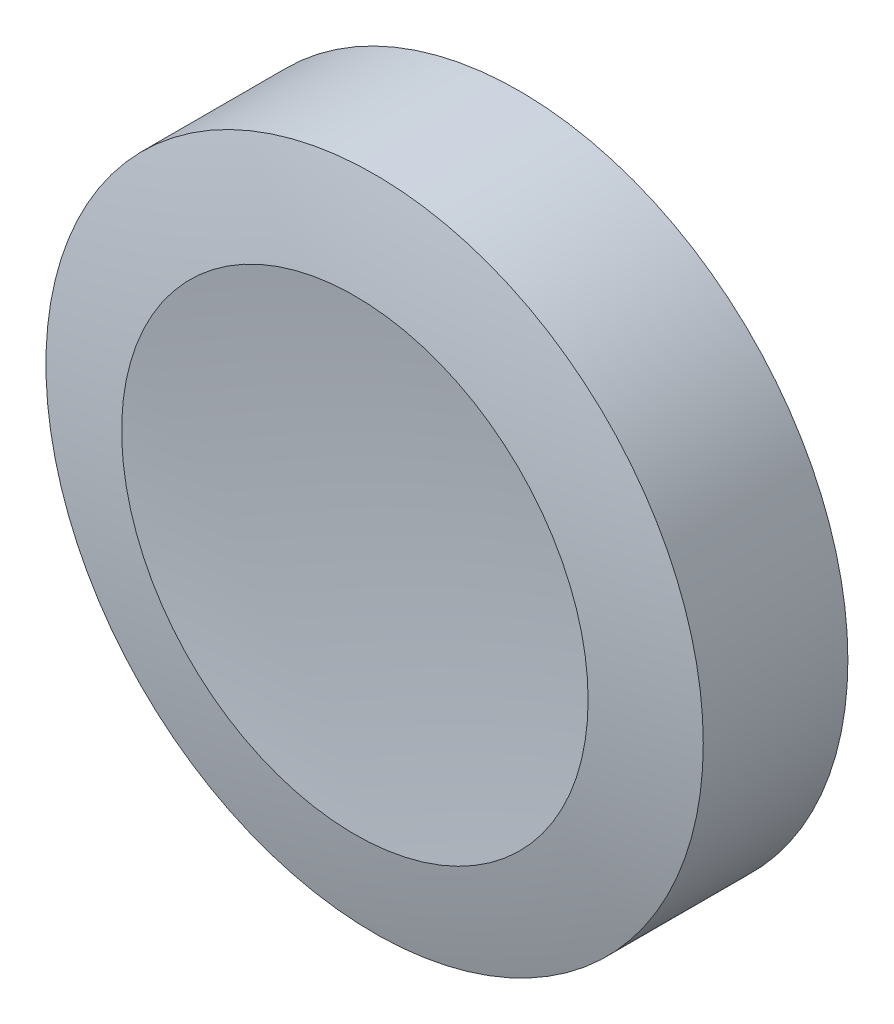
ISO-10303-21;
HEADER;
FILE_DESCRIPTION(('STEP AP214'),'2;1');
FILE_NAME('part.step','',(''),(''),'','','');
FILE_SCHEMA(('AUTOMOTIVE_DESIGN { 1 0 10303 214 1 1 1 1 }'));
ENDSEC;
DATA;
#1=APPLICATION_CONTEXT('core data for automotive mechanical design processes');
#2=APPLICATION_PROTOCOL_DEFINITION('international standard','automotive_design',2000,#1);
#3=PRODUCT_CONTEXT('',#1,'mechanical');
#4=PRODUCT('Part','Part','',(#3));
#5=PRODUCT_RELATED_PRODUCT_CATEGORY('part','',(#4));
#6=PRODUCT_DEFINITION_FORMATION('','',#4);
#7=PRODUCT_DEFINITION_CONTEXT('part definition',#1,'design');
#8=PRODUCT_DEFINITION('design','',#6,#7);
#9=PRODUCT_DEFINITION_SHAPE('','',#8);
#10=(LENGTH_UNIT() NAMED_UNIT(*) SI_UNIT(.MILLI.,.METRE.));
#11=(NAMED_UNIT(*) PLANE_ANGLE_UNIT() SI_UNIT($,.RADIAN.));
#12=(NAMED_UNIT(*) SI_UNIT($,.STERADIAN.) SOLID_ANGLE_UNIT());
#13=UNCERTAINTY_MEASURE_WITH_UNIT(LENGTH_MEASURE(1.E-05),#10,'distance_accuracy_value','');
#14=(GEOMETRIC_REPRESENTATION_CONTEXT(3) GLOBAL_UNCERTAINTY_ASSIGNED_CONTEXT((#13)) GLOBAL_UNIT_ASSIGNED_CONTEXT((#10,
#11,#12)) REPRESENTATION_CONTEXT('',''));
#15=CARTESIAN_POINT('',(0.,0.,0.));
#16=DIRECTION('',(0.,0.,1.));
#17=DIRECTION('',(1.,0.,0.));
#18=AXIS2_PLACEMENT_3D('',#15,#16,#17);
#19=CARTESIAN_POINT('',(0.,0.,-45.8333333333333));
#20=DIRECTION('',(0.,0.,1.));
#21=DIRECTION('',(1.,0.,0.));
#22=AXIS2_PLACEMENT_3D('',#19,#20,#21);
#23=SPHERICAL_SURFACE('',#22,52.8333333333334);
#24=CARTESIAN_POINT('',(0.,0.,5.50000000000001));
#25=DIRECTION('',(0.,0.,1.));
#26=DIRECTION('',(1.,0.,0.));
#27=AXIS2_PLACEMENT_3D('',#24,#25,#26);
#28=CIRCLE('',#27,12.5);
#29=CARTESIAN_POINT('',(12.5,0.,5.50000000000001));
#30=VERTEX_POINT('',#29);
#31=EDGE_CURVE('E10',#30,#30,#28,.T.);
#32=CARTESIAN_POINT('',(0.,0.,6.25000000000001));
#33=DIRECTION('',(0.,0.,1.));
#34=DIRECTION('',(1.,0.,0.));
#35=AXIS2_PLACEMENT_3D('',#32,#33,#34);
#36=CIRCLE('',#35,8.8705974996051);
#37=CARTESIAN_POINT('',(8.87059749960511,0.,6.25000000000001));
#38=VERTEX_POINT('',#37);
#39=EDGE_CURVE('E35',#38,#38,#36,.F.);
#40=CARTESIAN_POINT('',(12.5,0.,5.50000000000001));
#41=CARTESIAN_POINT('',(12.4624833007419,0.,5.5091355599595));
#42=CARTESIAN_POINT('',(12.4249565864356,0.,5.5182299914531));
#43=CARTESIAN_POINT('',(12.3498833082003,0.,5.53633655410177));
#44=CARTESIAN_POINT('',(12.3123367442714,0.,5.54534868525683));
#45=CARTESIAN_POINT('',(12.2372239472649,0.,5.56329060382164));
#46=CARTESIAN_POINT('',(12.1996577141873,0.,5.57222039123139));
#47=CARTESIAN_POINT('',(12.1245057594773,0.,5.58999757940067));
#48=CARTESIAN_POINT('',(12.0869200378449,0.,5.5988449801602));
#49=CARTESIAN_POINT('',(12.0117292867063,0.,5.61645735249175));
#50=CARTESIAN_POINT('',(11.9741242572,0.,5.62522232406377));
#51=CARTESIAN_POINT('',(11.8988950710891,0.,5.64266979588691));
#52=CARTESIAN_POINT('',(11.8612709144844,0.,5.65135229613802));
#53=CARTESIAN_POINT('',(11.7860036550435,0.,5.66863478358036));
#54=CARTESIAN_POINT('',(11.7483605522073,0.,5.67723477077159));
#55=CARTESIAN_POINT('',(11.6730555812616,0.,5.69435219075235));
#56=CARTESIAN_POINT('',(11.635393713152,0.,5.70286962354188));
#57=CARTESIAN_POINT('',(11.5600513927079,0.,5.71982189377419));
#58=CARTESIAN_POINT('',(11.5223709403733,0.,5.72825673121697));
#59=CARTESIAN_POINT('',(11.4469916326167,0.,5.74504377020777));
#60=CARTESIAN_POINT('',(11.4092927771948,0.,5.7533959717558));
#61=CARTESIAN_POINT('',(11.3338768444896,0.,5.77001769880637));
#62=CARTESIAN_POINT('',(11.2961597672064,0.,5.77828722430891));
#63=CARTESIAN_POINT('',(11.2207075720924,0.,5.79474355951518));
#64=CARTESIAN_POINT('',(11.1829724542617,0.,5.80293036921891));
#65=CARTESIAN_POINT('',(11.1074843594531,0.,5.81922123347193));
#66=CARTESIAN_POINT('',(11.0697313824753,0.,5.8273252880212));
#67=CARTESIAN_POINT('',(10.9942077508589,0.,5.84345060300742));
#68=CARTESIAN_POINT('',(10.9564370962203,0.,5.85147186344436));
#69=CARTESIAN_POINT('',(10.8808782908536,0.,5.86743155164609));
#70=CARTESIAN_POINT('',(10.8430901401255,0.,5.87536997941087));
#71=CARTESIAN_POINT('',(10.7674965242353,0.,5.89116396410661));
#72=CARTESIAN_POINT('',(10.7296910590731,0.,5.89901952103758));
#73=CARTESIAN_POINT('',(10.6540629960532,0.,5.91464772630242));
#74=CARTESIAN_POINT('',(10.6162403981955,0.,5.9224203746363));
#75=CARTESIAN_POINT('',(10.5405782516057,0.,5.93788272534225));
#76=CARTESIAN_POINT('',(10.5027387028735,0.,5.94557242771432));
#77=CARTESIAN_POINT('',(10.4270428364372,0.,5.96086884953068));
#78=CARTESIAN_POINT('',(10.389186518733,0.,5.96847556897497));
#79=CARTESIAN_POINT('',(10.3134572963356,0.,5.98360598836872));
#80=CARTESIAN_POINT('',(10.2755843916425,0.,5.99112968831817));
#81=CARTESIAN_POINT('',(10.1998221773301,0.,6.00609403255427));
#82=CARTESIAN_POINT('',(10.1619328677108,0.,6.01353467684091));
#83=CARTESIAN_POINT('',(10.0861380256878,0.,6.02833287398269));
#84=CARTESIAN_POINT('',(10.0482324932841,0.,6.03569042683783));
#85=CARTESIAN_POINT('',(9.97240538791189,0.,6.05032240574732));
#86=CARTESIAN_POINT('',(9.9344838149434,0.,6.05759683180167));
#87=CARTESIAN_POINT('',(9.85862481073841,0.,6.07206252213995));
#88=CARTESIAN_POINT('',(9.82068737950191,0.,6.07925378642388));
#89=CARTESIAN_POINT('',(9.74479684113393,0.,6.09355311865141));
#90=CARTESIAN_POINT('',(9.70684373400244,0.,6.10066118659501));
#91=CARTESIAN_POINT('',(9.63092202629284,0.,6.11479409197199));
#92=CARTESIAN_POINT('',(9.59295342571473,0.,6.12181892940536));
#93=CARTESIAN_POINT('',(9.51700091363472,0.,6.13578533999192));
#94=CARTESIAN_POINT('',(9.47901700213282,0.,6.14272691314511));
#95=CARTESIAN_POINT('',(9.40303405080176,0.,6.15652676180219));
#96=CARTESIAN_POINT('',(9.3650350109726,0.,6.16338503730606));
#97=CARTESIAN_POINT('',(9.28902198565591,0.,6.17701825769374));
#98=CARTESIAN_POINT('',(9.25100800016838,0.,6.18379320257754));
#99=CARTESIAN_POINT('',(9.17496526627702,0.,6.1972597291626));
#100=CARTESIAN_POINT('',(9.13693651787319,0.,6.20395131086385));
#101=CARTESIAN_POINT('',(9.06086444095731,0.,6.21725107889331));
#102=CARTESIAN_POINT('',(9.02282111244526,0.,6.22385926522151));
#103=CARTESIAN_POINT('',(8.94672005820964,0.,6.2369922108227));
#104=CARTESIAN_POINT('',(8.90866233248608,0.,6.24351697009569));
#105=CARTESIAN_POINT('',(8.87059749960511,0.,6.25000000000001));
#106=B_SPLINE_CURVE_WITH_KNOTS('',3,(#40,#41,#42,#43,#44,#45,#46,#47,#48,#49,#50,#51,#52,#53,
#54,#55,#56,#57,#58,#59,#60,#61,#62,#63,#64,#65,#66,#67,#68,#69,#70,#71,#72,#73,#74,#75,#76,#77,
#78,#79,#80,#81,#82,#83,#84,#85,#86,#87,#88,#89,#90,#91,#92,#93,#94,#95,#96,#97,#98,#99,#100,
#101,#102,#103,#104,#105),.UNSPECIFIED.,.F.,.F.,(4,2,2,2,2,2,2,2,2,2,2,2,2,2,2,2,2,2,2,2,2,2,2,
2,2,2,2,2,2,2,2,2,4),(0.,0.115838876182999,0.231677752366008,0.347516628549005,
0.463355504732016,0.579194380915015,0.695033257098024,0.810872133281023,0.926711009464035,
1.04254988564703,1.15838876183003,1.27422763801304,1.39006651419604,1.50590539037905,
1.62174426656205,1.73758314274506,1.85342201892805,1.96926089511106,2.08509977129406,
2.20093864747706,2.31677752366007,2.43261639984307,2.54845527602608,2.66429415220908,
2.78013302839208,2.89597190457509,3.01181078075808,3.1276496569411,3.24348853312409,
3.3593274093071,3.4751662854901,3.59100516167311,3.70684403785611),.UNSPECIFIED.);
#107=EDGE_CURVE('BSEAM31',#30,#38,#106,.T.);
#108=ORIENTED_EDGE('',*,*,#31,.T.);
#109=ORIENTED_EDGE('',*,*,#39,.T.);
#110=ORIENTED_EDGE('',*,*,#107,.T.);
#111=ORIENTED_EDGE('',*,*,#107,.F.);
#112=EDGE_LOOP('',(#108,#110,#109,#111));
#113=FACE_BOUND('',#112,.T.);
#114=ADVANCED_FACE('F31',(#113),#23,.T.);
#115=CARTESIAN_POINT('',(0.,0.,5.50000000000001));
#116=DIRECTION('',(0.,0.,-1.));
#117=DIRECTION('',(-1.,0.,0.));
#118=AXIS2_PLACEMENT_3D('',#115,#116,#117);
#119=CYLINDRICAL_SURFACE('',#118,12.5);
#120=ORIENTED_EDGE('',*,*,#31,.F.);
#121=EDGE_LOOP('',(#120));
#122=FACE_BOUND('',#121,.T.);
#123=CARTESIAN_POINT('',(0.,0.,0.));
#124=DIRECTION('',(0.,0.,1.));
#125=DIRECTION('',(1.,0.,0.));
#126=AXIS2_PLACEMENT_3D('',#123,#124,#125);
#127=CIRCLE('',#126,12.5);
#128=CARTESIAN_POINT('',(12.5,0.,0.));
#129=VERTEX_POINT('',#128);
#130=EDGE_CURVE('E39',#129,#129,#127,.T.);
#131=ORIENTED_EDGE('',*,*,#130,.T.);
#132=EDGE_LOOP('',(#131));
#133=FACE_BOUND('',#132,.T.);
#134=ADVANCED_FACE('F55',(#122,#133),#119,.T.);
#135=CARTESIAN_POINT('',(0.,0.,0.));
#136=DIRECTION('',(0.,0.,1.));
#137=DIRECTION('',(1.,0.,0.));
#138=AXIS2_PLACEMENT_3D('',#135,#136,#137);
#139=PLANE('',#138);
#140=ORIENTED_EDGE('',*,*,#130,.F.);
#141=EDGE_LOOP('',(#140));
#142=FACE_BOUND('',#141,.T.);
#143=ADVANCED_FACE('F51',(#142),#139,.F.);
#144=CARTESIAN_POINT('',(0.,0.,84.6874999999998));
#145=DIRECTION('',(0.,0.,1.));
#146=DIRECTION('',(1.,0.,0.));
#147=AXIS2_PLACEMENT_3D('',#144,#145,#146);
#148=SPHERICAL_SURFACE('',#147,78.9374999999999);
#149=ORIENTED_EDGE('',*,*,#39,.F.);
#150=EDGE_LOOP('',(#149));
#151=FACE_BOUND('',#150,.T.);
#152=ADVANCED_FACE('F33',(#151),#148,.F.);
#153=CLOSED_SHELL('',(#114,#134,#143,#152));
#154=MANIFOLD_SOLID_BREP('B2',#153);
#155=ADVANCED_BREP_SHAPE_REPRESENTATION('',(#18,#154),#14);
#156=SHAPE_DEFINITION_REPRESENTATION(#9,#155);
ENDSEC;
END-ISO-10303-21;
